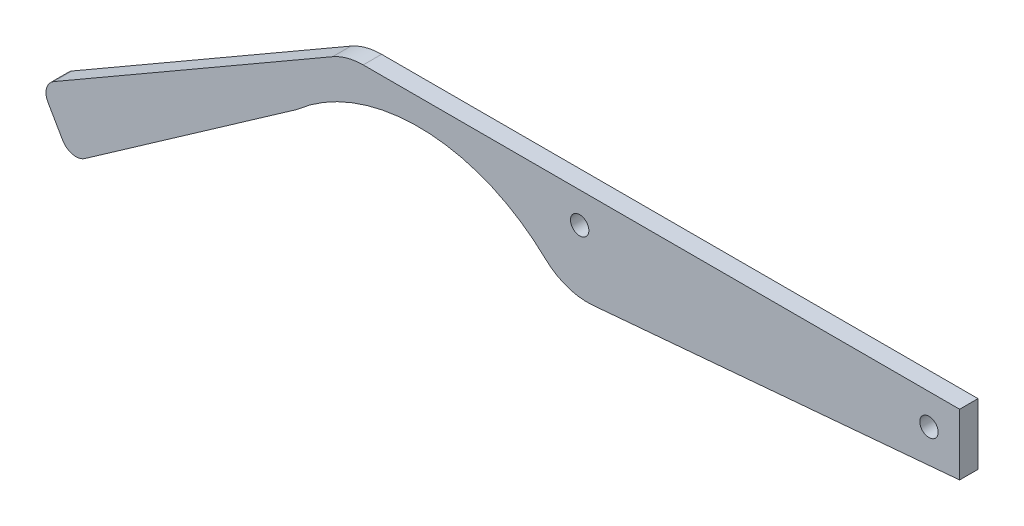
ISO-10303-21;
HEADER;
FILE_DESCRIPTION(('STEP AP214'),'2;1');
FILE_NAME('part.step','',(''),(''),'','','');
FILE_SCHEMA(('AUTOMOTIVE_DESIGN { 1 0 10303 214 1 1 1 1 }'));
ENDSEC;
DATA;
#1=APPLICATION_CONTEXT('core data for automotive mechanical design processes');
#2=APPLICATION_PROTOCOL_DEFINITION('international standard','automotive_design',2000,#1);
#3=PRODUCT_CONTEXT('',#1,'mechanical');
#4=PRODUCT('Part','Part','',(#3));
#5=PRODUCT_RELATED_PRODUCT_CATEGORY('part','',(#4));
#6=PRODUCT_DEFINITION_FORMATION('','',#4);
#7=PRODUCT_DEFINITION_CONTEXT('part definition',#1,'design');
#8=PRODUCT_DEFINITION('design','',#6,#7);
#9=PRODUCT_DEFINITION_SHAPE('','',#8);
#10=(LENGTH_UNIT() NAMED_UNIT(*) SI_UNIT(.MILLI.,.METRE.));
#11=(NAMED_UNIT(*) PLANE_ANGLE_UNIT() SI_UNIT($,.RADIAN.));
#12=(NAMED_UNIT(*) SI_UNIT($,.STERADIAN.) SOLID_ANGLE_UNIT());
#13=UNCERTAINTY_MEASURE_WITH_UNIT(LENGTH_MEASURE(1.E-05),#10,'distance_accuracy_value','');
#14=(GEOMETRIC_REPRESENTATION_CONTEXT(3) GLOBAL_UNCERTAINTY_ASSIGNED_CONTEXT((#13)) GLOBAL_UNIT_ASSIGNED_CONTEXT((#10,
#11,#12)) REPRESENTATION_CONTEXT('',''));
#15=CARTESIAN_POINT('',(0.,0.,0.));
#16=DIRECTION('',(0.,0.,1.));
#17=DIRECTION('',(1.,0.,0.));
#18=AXIS2_PLACEMENT_3D('',#15,#16,#17);
#19=CARTESIAN_POINT('',(0.,-10.,3.));
#20=DIRECTION('',(-1.,0.,0.));
#21=DIRECTION('',(0.,0.,1.));
#22=AXIS2_PLACEMENT_3D('',#19,#20,#21);
#23=PLANE('',#22);
#24=DIRECTION('',(0.,1.,0.));
#25=VECTOR('',#24,1.);
#26=CARTESIAN_POINT('',(0.,-10.,0.));
#27=LINE('',#26,#25);
#28=CARTESIAN_POINT('',(0.,-10.,0.));
#29=VERTEX_POINT('',#28);
#30=CARTESIAN_POINT('',(0.,0.,0.));
#31=VERTEX_POINT('',#30);
#32=EDGE_CURVE('E153',#29,#31,#27,.T.);
#33=ORIENTED_EDGE('',*,*,#32,.T.);
#34=DIRECTION('',(0.,0.,-1.));
#35=VECTOR('',#34,1.);
#36=CARTESIAN_POINT('',(0.,0.,3.));
#37=LINE('',#36,#35);
#38=CARTESIAN_POINT('',(0.,0.,3.));
#39=VERTEX_POINT('',#38);
#40=EDGE_CURVE('E11',#39,#31,#37,.T.);
#41=ORIENTED_EDGE('',*,*,#40,.F.);
#42=DIRECTION('',(0.,1.,0.));
#43=VECTOR('',#42,1.);
#44=CARTESIAN_POINT('',(0.,-10.,3.));
#45=LINE('',#44,#43);
#46=CARTESIAN_POINT('',(0.,-10.,3.));
#47=VERTEX_POINT('',#46);
#48=EDGE_CURVE('E176',#47,#39,#45,.T.);
#49=ORIENTED_EDGE('',*,*,#48,.F.);
#50=DIRECTION('',(0.,0.,-1.));
#51=VECTOR('',#50,1.);
#52=CARTESIAN_POINT('',(0.,-10.,3.));
#53=LINE('',#52,#51);
#54=EDGE_CURVE('E149',#47,#29,#53,.T.);
#55=ORIENTED_EDGE('',*,*,#54,.T.);
#56=EDGE_LOOP('',(#33,#41,#49,#55));
#57=FACE_BOUND('',#56,.T.);
#58=ADVANCED_FACE('F33',(#57),#23,.F.);
#59=CARTESIAN_POINT('',(0.,0.,3.));
#60=DIRECTION('',(0.,-1.,0.));
#61=DIRECTION('',(1.,0.,0.));
#62=AXIS2_PLACEMENT_3D('',#59,#60,#61);
#63=PLANE('',#62);
#64=DIRECTION('',(-1.,0.,0.));
#65=VECTOR('',#64,1.);
#66=CARTESIAN_POINT('',(0.,0.,0.));
#67=LINE('',#66,#65);
#68=CARTESIAN_POINT('',(-97.3205080756888,0.,0.));
#69=VERTEX_POINT('',#68);
#70=EDGE_CURVE('E156',#31,#69,#67,.T.);
#71=ORIENTED_EDGE('',*,*,#70,.T.);
#72=DIRECTION('',(0.,0.,-1.));
#73=VECTOR('',#72,1.);
#74=CARTESIAN_POINT('',(-97.3205080756888,0.,3.));
#75=LINE('',#74,#73);
#76=CARTESIAN_POINT('',(-97.3205080756888,0.,3.));
#77=VERTEX_POINT('',#76);
#78=EDGE_CURVE('E41',#77,#69,#75,.T.);
#79=ORIENTED_EDGE('',*,*,#78,.F.);
#80=DIRECTION('',(-1.,0.,0.));
#81=VECTOR('',#80,1.);
#82=CARTESIAN_POINT('',(0.,0.,3.));
#83=LINE('',#82,#81);
#84=EDGE_CURVE('E104',#39,#77,#83,.T.);
#85=ORIENTED_EDGE('',*,*,#84,.F.);
#86=ORIENTED_EDGE('',*,*,#40,.T.);
#87=EDGE_LOOP('',(#71,#79,#85,#86));
#88=FACE_BOUND('',#87,.T.);
#89=ADVANCED_FACE('F256',(#88),#63,.F.);
#90=CARTESIAN_POINT('',(-97.3205080756888,-10.,3.));
#91=DIRECTION('',(0.,0.,-1.));
#92=DIRECTION('',(-1.,0.,0.));
#93=AXIS2_PLACEMENT_3D('',#90,#91,#92);
#94=CYLINDRICAL_SURFACE('',#93,10.);
#95=CARTESIAN_POINT('',(-97.3205080756888,-10.,0.));
#96=DIRECTION('',(0.,0.,1.));
#97=DIRECTION('',(1.,0.,0.));
#98=AXIS2_PLACEMENT_3D('',#95,#96,#97);
#99=CIRCLE('',#98,10.);
#100=CARTESIAN_POINT('',(-102.320508075689,-1.33974596215564,0.));
#101=VERTEX_POINT('',#100);
#102=EDGE_CURVE('E159',#69,#101,#99,.T.);
#103=ORIENTED_EDGE('',*,*,#102,.T.);
#104=DIRECTION('',(0.,0.,-1.));
#105=VECTOR('',#104,1.);
#106=CARTESIAN_POINT('',(-102.320508075689,-1.33974596215564,3.));
#107=LINE('',#106,#105);
#108=CARTESIAN_POINT('',(-102.320508075689,-1.33974596215564,3.));
#109=VERTEX_POINT('',#108);
#110=EDGE_CURVE('E195',#109,#101,#107,.T.);
#111=ORIENTED_EDGE('',*,*,#110,.F.);
#112=CARTESIAN_POINT('',(-97.3205080756888,-10.,3.));
#113=DIRECTION('',(0.,0.,1.));
#114=DIRECTION('',(1.,0.,0.));
#115=AXIS2_PLACEMENT_3D('',#112,#113,#114);
#116=CIRCLE('',#115,10.);
#117=EDGE_CURVE('E203',#77,#109,#116,.T.);
#118=ORIENTED_EDGE('',*,*,#117,.F.);
#119=ORIENTED_EDGE('',*,*,#78,.T.);
#120=EDGE_LOOP('',(#103,#111,#118,#119));
#121=FACE_BOUND('',#120,.T.);
#122=ADVANCED_FACE('F201',(#121),#94,.T.);
#123=CARTESIAN_POINT('',(-102.320508075689,-1.33974596215564,3.));
#124=DIRECTION('',(0.500000000000001,-0.866025403784438,0.));
#125=DIRECTION('',(0.866025403784438,0.500000000000002,0.));
#126=AXIS2_PLACEMENT_3D('',#123,#124,#125);
#127=PLANE('',#126);
#128=DIRECTION('',(-0.866025403784438,-0.500000000000002,0.));
#129=VECTOR('',#128,1.);
#130=CARTESIAN_POINT('',(-102.320508075689,-1.33974596215564,0.));
#131=LINE('',#130,#129);
#132=CARTESIAN_POINT('',(-147.834936490539,-27.6175134594814,0.));
#133=VERTEX_POINT('',#132);
#134=EDGE_CURVE('E161',#101,#133,#131,.T.);
#135=ORIENTED_EDGE('',*,*,#134,.T.);
#136=DIRECTION('',(0.,0.,-1.));
#137=VECTOR('',#136,1.);
#138=CARTESIAN_POINT('',(-147.834936490539,-27.6175134594814,3.));
#139=LINE('',#138,#137);
#140=CARTESIAN_POINT('',(-147.834936490539,-27.6175134594814,3.));
#141=VERTEX_POINT('',#140);
#142=EDGE_CURVE('E192',#141,#133,#139,.T.);
#143=ORIENTED_EDGE('',*,*,#142,.F.);
#144=DIRECTION('',(-0.866025403784438,-0.500000000000002,0.));
#145=VECTOR('',#144,1.);
#146=CARTESIAN_POINT('',(-102.320508075689,-1.33974596215564,3.));
#147=LINE('',#146,#145);
#148=EDGE_CURVE('E221',#109,#141,#147,.T.);
#149=ORIENTED_EDGE('',*,*,#148,.F.);
#150=ORIENTED_EDGE('',*,*,#110,.T.);
#151=EDGE_LOOP('',(#135,#143,#149,#150));
#152=FACE_BOUND('',#151,.T.);
#153=ADVANCED_FACE('F212',(#152),#127,.F.);
#154=CARTESIAN_POINT('',(-146.584936490539,-29.7825769689425,3.));
#155=DIRECTION('',(0.,0.,-1.));
#156=DIRECTION('',(-1.,0.,0.));
#157=AXIS2_PLACEMENT_3D('',#154,#155,#156);
#158=CYLINDRICAL_SURFACE('',#157,2.50000000000001);
#159=CARTESIAN_POINT('',(-146.584936490539,-29.7825769689425,0.));
#160=DIRECTION('',(0.,0.,1.));
#161=DIRECTION('',(1.,0.,0.));
#162=AXIS2_PLACEMENT_3D('',#159,#160,#161);
#163=CIRCLE('',#162,2.50000000000001);
#164=CARTESIAN_POINT('',(-148.75,-31.0325769689425,0.));
#165=VERTEX_POINT('',#164);
#166=EDGE_CURVE('E163',#133,#165,#163,.T.);
#167=ORIENTED_EDGE('',*,*,#166,.T.);
#168=DIRECTION('',(0.,0.,-1.));
#169=VECTOR('',#168,1.);
#170=CARTESIAN_POINT('',(-148.75,-31.0325769689425,3.));
#171=LINE('',#170,#169);
#172=CARTESIAN_POINT('',(-148.75,-31.0325769689425,3.));
#173=VERTEX_POINT('',#172);
#174=EDGE_CURVE('E189',#173,#165,#171,.T.);
#175=ORIENTED_EDGE('',*,*,#174,.F.);
#176=CARTESIAN_POINT('',(-146.584936490539,-29.7825769689425,3.));
#177=DIRECTION('',(0.,0.,1.));
#178=DIRECTION('',(1.,0.,0.));
#179=AXIS2_PLACEMENT_3D('',#176,#177,#178);
#180=CIRCLE('',#179,2.50000000000001);
#181=EDGE_CURVE('E218',#141,#173,#180,.T.);
#182=ORIENTED_EDGE('',*,*,#181,.F.);
#183=ORIENTED_EDGE('',*,*,#142,.T.);
#184=EDGE_LOOP('',(#167,#175,#182,#183));
#185=FACE_BOUND('',#184,.T.);
#186=ADVANCED_FACE('F216',(#185),#158,.T.);
#187=CARTESIAN_POINT('',(-148.75,-31.0325769689425,3.));
#188=DIRECTION('',(0.866025403784435,0.500000000000006,0.));
#189=DIRECTION('',(-0.500000000000006,0.866025403784435,0.));
#190=AXIS2_PLACEMENT_3D('',#187,#188,#189);
#191=PLANE('',#190);
#192=DIRECTION('',(0.500000000000006,-0.866025403784435,0.));
#193=VECTOR('',#192,1.);
#194=CARTESIAN_POINT('',(-148.75,-31.0325769689425,0.));
#195=LINE('',#194,#193);
#196=CARTESIAN_POINT('',(-146.364135626337,-35.165015284096,0.));
#197=VERTEX_POINT('',#196);
#198=EDGE_CURVE('E165',#165,#197,#195,.T.);
#199=ORIENTED_EDGE('',*,*,#198,.T.);
#200=DIRECTION('',(0.,0.,-1.));
#201=VECTOR('',#200,1.);
#202=CARTESIAN_POINT('',(-146.364135626337,-35.165015284096,3.));
#203=LINE('',#202,#201);
#204=CARTESIAN_POINT('',(-146.364135626337,-35.165015284096,3.));
#205=VERTEX_POINT('',#204);
#206=EDGE_CURVE('E186',#205,#197,#203,.T.);
#207=ORIENTED_EDGE('',*,*,#206,.F.);
#208=DIRECTION('',(0.500000000000006,-0.866025403784435,0.));
#209=VECTOR('',#208,1.);
#210=CARTESIAN_POINT('',(-148.75,-31.0325769689425,3.));
#211=LINE('',#210,#209);
#212=EDGE_CURVE('E220',#173,#205,#211,.T.);
#213=ORIENTED_EDGE('',*,*,#212,.F.);
#214=ORIENTED_EDGE('',*,*,#174,.T.);
#215=EDGE_LOOP('',(#199,#207,#213,#214));
#216=FACE_BOUND('',#215,.T.);
#217=ADVANCED_FACE('F269',(#216),#191,.F.);
#218=CARTESIAN_POINT('',(-144.199072116875,-33.915015284096,3.));
#219=DIRECTION('',(0.,0.,-1.));
#220=DIRECTION('',(-1.,0.,0.));
#221=AXIS2_PLACEMENT_3D('',#218,#219,#220);
#222=CYLINDRICAL_SURFACE('',#221,2.49999999999999);
#223=CARTESIAN_POINT('',(-144.199072116875,-33.915015284096,0.));
#224=DIRECTION('',(0.,0.,1.));
#225=DIRECTION('',(1.,0.,0.));
#226=AXIS2_PLACEMENT_3D('',#223,#224,#225);
#227=CIRCLE('',#226,2.49999999999999);
#228=CARTESIAN_POINT('',(-142.765131025998,-35.9628953948185,0.));
#229=VERTEX_POINT('',#228);
#230=EDGE_CURVE('E167',#197,#229,#227,.T.);
#231=ORIENTED_EDGE('',*,*,#230,.T.);
#232=DIRECTION('',(0.,0.,-1.));
#233=VECTOR('',#232,1.);
#234=CARTESIAN_POINT('',(-142.765131025998,-35.9628953948185,3.));
#235=LINE('',#234,#233);
#236=CARTESIAN_POINT('',(-142.765131025998,-35.9628953948185,3.));
#237=VERTEX_POINT('',#236);
#238=EDGE_CURVE('E183',#237,#229,#235,.T.);
#239=ORIENTED_EDGE('',*,*,#238,.F.);
#240=CARTESIAN_POINT('',(-144.199072116875,-33.915015284096,3.));
#241=DIRECTION('',(0.,0.,1.));
#242=DIRECTION('',(1.,0.,0.));
#243=AXIS2_PLACEMENT_3D('',#240,#241,#242);
#244=CIRCLE('',#243,2.49999999999999);
#245=EDGE_CURVE('E223',#205,#237,#244,.T.);
#246=ORIENTED_EDGE('',*,*,#245,.F.);
#247=ORIENTED_EDGE('',*,*,#206,.T.);
#248=EDGE_LOOP('',(#231,#239,#246,#247));
#249=FACE_BOUND('',#248,.T.);
#250=ADVANCED_FACE('F272',(#249),#222,.T.);
#251=CARTESIAN_POINT('',(-142.765131025998,-35.9628953948185,3.));
#252=DIRECTION('',(-0.573576436351051,0.819152044288988,0.));
#253=DIRECTION('',(-0.819152044288989,-0.573576436351051,0.));
#254=AXIS2_PLACEMENT_3D('',#251,#252,#253);
#255=PLANE('',#254);
#256=DIRECTION('',(0.819152044288989,0.573576436351051,0.));
#257=VECTOR('',#256,1.);
#258=CARTESIAN_POINT('',(-142.765131025998,-35.9628953948185,0.));
#259=LINE('',#258,#257);
#260=CARTESIAN_POINT('',(-108.249632242699,-11.7948829616843,0.));
#261=VERTEX_POINT('',#260);
#262=EDGE_CURVE('E169',#229,#261,#259,.T.);
#263=ORIENTED_EDGE('',*,*,#262,.T.);
#264=DIRECTION('',(0.,0.,-1.));
#265=VECTOR('',#264,1.);
#266=CARTESIAN_POINT('',(-108.249632242699,-11.7948829616843,3.));
#267=LINE('',#266,#265);
#268=CARTESIAN_POINT('',(-108.249632242699,-11.7948829616843,3.));
#269=VERTEX_POINT('',#268);
#270=EDGE_CURVE('E180',#269,#261,#267,.T.);
#271=ORIENTED_EDGE('',*,*,#270,.F.);
#272=DIRECTION('',(0.819152044288989,0.573576436351051,0.));
#273=VECTOR('',#272,1.);
#274=CARTESIAN_POINT('',(-142.765131025998,-35.9628953948185,3.));
#275=LINE('',#274,#273);
#276=EDGE_CURVE('E229',#237,#269,#275,.T.);
#277=ORIENTED_EDGE('',*,*,#276,.F.);
#278=ORIENTED_EDGE('',*,*,#238,.T.);
#279=EDGE_LOOP('',(#263,#271,#277,#278));
#280=FACE_BOUND('',#279,.T.);
#281=ADVANCED_FACE('F235',(#280),#255,.F.);
#282=CARTESIAN_POINT('',(-109.683573333577,-9.74700285096188,3.));
#283=DIRECTION('',(0.,0.,-1.));
#284=DIRECTION('',(-1.,0.,0.));
#285=AXIS2_PLACEMENT_3D('',#282,#283,#284);
#286=CYLINDRICAL_SURFACE('',#285,2.49999999999999);
#287=CARTESIAN_POINT('',(-109.683573333577,-9.74700285096188,0.));
#288=DIRECTION('',(0.,0.,1.));
#289=DIRECTION('',(1.,0.,0.));
#290=AXIS2_PLACEMENT_3D('',#287,#288,#289);
#291=CIRCLE('',#290,2.49999999999999);
#292=CARTESIAN_POINT('',(-108.039833803987,-11.6306483480934,0.));
#293=VERTEX_POINT('',#292);
#294=EDGE_CURVE('E171',#261,#293,#291,.T.);
#295=ORIENTED_EDGE('',*,*,#294,.T.);
#296=DIRECTION('',(0.,0.,-1.));
#297=VECTOR('',#296,1.);
#298=CARTESIAN_POINT('',(-108.039833803987,-11.6306483480934,3.));
#299=LINE('',#298,#297);
#300=CARTESIAN_POINT('',(-108.039833803987,-11.6306483480934,3.));
#301=VERTEX_POINT('',#300);
#302=EDGE_CURVE('E144',#301,#293,#299,.T.);
#303=ORIENTED_EDGE('',*,*,#302,.F.);
#304=CARTESIAN_POINT('',(-109.683573333577,-9.74700285096188,3.));
#305=DIRECTION('',(0.,0.,1.));
#306=DIRECTION('',(1.,0.,0.));
#307=AXIS2_PLACEMENT_3D('',#304,#305,#306);
#308=CIRCLE('',#307,2.49999999999999);
#309=EDGE_CURVE('E135',#269,#301,#308,.T.);
#310=ORIENTED_EDGE('',*,*,#309,.F.);
#311=ORIENTED_EDGE('',*,*,#270,.T.);
#312=EDGE_LOOP('',(#295,#303,#310,#311));
#313=FACE_BOUND('',#312,.T.);
#314=ADVANCED_FACE('F239',(#313),#286,.T.);
#315=CARTESIAN_POINT('',(-88.3149594489092,-34.2343943136717,3.));
#316=DIRECTION('',(0.,0.,-1.));
#317=DIRECTION('',(-1.,0.,0.));
#318=AXIS2_PLACEMENT_3D('',#315,#316,#317);
#319=CYLINDRICAL_SURFACE('',#318,30.);
#320=CARTESIAN_POINT('',(-88.3149594489092,-34.2343943136717,0.));
#321=DIRECTION('',(0.,0.,-1.));
#322=DIRECTION('',(-1.,0.,0.));
#323=AXIS2_PLACEMENT_3D('',#320,#321,#322);
#324=CIRCLE('',#323,30.);
#325=CARTESIAN_POINT('',(-67.620976194796,-12.5143791875609,0.));
#326=VERTEX_POINT('',#325);
#327=EDGE_CURVE('E143',#293,#326,#324,.T.);
#328=ORIENTED_EDGE('',*,*,#327,.T.);
#329=DIRECTION('',(0.,0.,-1.));
#330=VECTOR('',#329,1.);
#331=CARTESIAN_POINT('',(-67.620976194796,-12.5143791875609,3.));
#332=LINE('',#331,#330);
#333=CARTESIAN_POINT('',(-67.620976194796,-12.5143791875609,3.));
#334=VERTEX_POINT('',#333);
#335=EDGE_CURVE('E140',#334,#326,#332,.T.);
#336=ORIENTED_EDGE('',*,*,#335,.F.);
#337=CARTESIAN_POINT('',(-88.3149594489092,-34.2343943136717,3.));
#338=DIRECTION('',(0.,0.,-1.));
#339=DIRECTION('',(-1.,0.,0.));
#340=AXIS2_PLACEMENT_3D('',#337,#338,#339);
#341=CIRCLE('',#340,30.);
#342=EDGE_CURVE('E129',#301,#334,#341,.T.);
#343=ORIENTED_EDGE('',*,*,#342,.F.);
#344=ORIENTED_EDGE('',*,*,#302,.T.);
#345=EDGE_LOOP('',(#328,#336,#343,#344));
#346=FACE_BOUND('',#345,.T.);
#347=ADVANCED_FACE('F141',(#346),#319,.F.);
#348=CARTESIAN_POINT('',(-60.7229817767583,-5.27437414552395,3.));
#349=DIRECTION('',(0.,0.,-1.));
#350=DIRECTION('',(-1.,0.,0.));
#351=AXIS2_PLACEMENT_3D('',#348,#349,#350);
#352=CYLINDRICAL_SURFACE('',#351,9.99999999999999);
#353=CARTESIAN_POINT('',(-60.7229817767583,-5.27437414552395,0.));
#354=DIRECTION('',(0.,0.,1.));
#355=DIRECTION('',(1.,0.,0.));
#356=AXIS2_PLACEMENT_3D('',#353,#354,#355);
#357=CIRCLE('',#356,9.99999999999999);
#358=CARTESIAN_POINT('',(-59.8514243492818,-15.2363211264414,0.));
#359=VERTEX_POINT('',#358);
#360=EDGE_CURVE('E90',#326,#359,#357,.T.);
#361=ORIENTED_EDGE('',*,*,#360,.T.);
#362=DIRECTION('',(0.,0.,-1.));
#363=VECTOR('',#362,1.);
#364=CARTESIAN_POINT('',(-59.8514243492818,-15.2363211264414,3.));
#365=LINE('',#364,#363);
#366=CARTESIAN_POINT('',(-59.8514243492818,-15.2363211264414,3.));
#367=VERTEX_POINT('',#366);
#368=EDGE_CURVE('E145',#367,#359,#365,.T.);
#369=ORIENTED_EDGE('',*,*,#368,.F.);
#370=CARTESIAN_POINT('',(-60.7229817767583,-5.27437414552395,3.));
#371=DIRECTION('',(0.,0.,1.));
#372=DIRECTION('',(1.,0.,0.));
#373=AXIS2_PLACEMENT_3D('',#370,#371,#372);
#374=CIRCLE('',#373,9.99999999999999);
#375=EDGE_CURVE('E133',#334,#367,#374,.T.);
#376=ORIENTED_EDGE('',*,*,#375,.F.);
#377=ORIENTED_EDGE('',*,*,#335,.T.);
#378=EDGE_LOOP('',(#361,#369,#376,#377));
#379=FACE_BOUND('',#378,.T.);
#380=ADVANCED_FACE('F147',(#379),#352,.T.);
#381=CARTESIAN_POINT('',(-59.8514243492818,-15.2363211264414,3.));
#382=DIRECTION('',(-0.0871557427476548,0.996194698091746,0.));
#383=DIRECTION('',(-0.996194698091746,-0.0871557427476548,0.));
#384=AXIS2_PLACEMENT_3D('',#381,#382,#383);
#385=PLANE('',#384);
#386=DIRECTION('',(0.996194698091746,0.0871557427476548,0.));
#387=VECTOR('',#386,1.);
#388=CARTESIAN_POINT('',(-59.8514243492818,-15.2363211264414,0.));
#389=LINE('',#388,#387);
#390=EDGE_CURVE('E96',#359,#29,#389,.T.);
#391=ORIENTED_EDGE('',*,*,#390,.T.);
#392=ORIENTED_EDGE('',*,*,#54,.F.);
#393=DIRECTION('',(0.996194698091746,0.0871557427476548,0.));
#394=VECTOR('',#393,1.);
#395=CARTESIAN_POINT('',(-59.8514243492818,-15.2363211264414,3.));
#396=LINE('',#395,#394);
#397=EDGE_CURVE('E49',#367,#47,#396,.T.);
#398=ORIENTED_EDGE('',*,*,#397,.F.);
#399=ORIENTED_EDGE('',*,*,#368,.T.);
#400=EDGE_LOOP('',(#391,#392,#398,#399));
#401=FACE_BOUND('',#400,.T.);
#402=ADVANCED_FACE('F243',(#401),#385,.F.);
#403=CARTESIAN_POINT('',(-97.3205080756888,-10.,3.));
#404=DIRECTION('',(0.,0.,1.));
#405=DIRECTION('',(1.,0.,0.));
#406=AXIS2_PLACEMENT_3D('',#403,#404,#405);
#407=PLANE('',#406);
#408=CARTESIAN_POINT('',(-5.,-5.,3.));
#409=DIRECTION('',(0.,0.,1.));
#410=DIRECTION('',(1.,0.,0.));
#411=AXIS2_PLACEMENT_3D('',#408,#409,#410);
#412=CIRCLE('',#411,1.5);
#413=CARTESIAN_POINT('',(-3.5,-5.,3.));
#414=VERTEX_POINT('',#413);
#415=EDGE_CURVE('E157',#414,#414,#412,.T.);
#416=ORIENTED_EDGE('',*,*,#415,.F.);
#417=EDGE_LOOP('',(#416));
#418=FACE_BOUND('',#417,.T.);
#419=CARTESIAN_POINT('',(-62.,-4.99999999999999,3.));
#420=DIRECTION('',(0.,0.,1.));
#421=DIRECTION('',(1.,0.,0.));
#422=AXIS2_PLACEMENT_3D('',#419,#420,#421);
#423=CIRCLE('',#422,1.5);
#424=CARTESIAN_POINT('',(-60.5,-4.99999999999999,3.));
#425=VERTEX_POINT('',#424);
#426=EDGE_CURVE('E333',#425,#425,#423,.T.);
#427=ORIENTED_EDGE('',*,*,#426,.F.);
#428=EDGE_LOOP('',(#427));
#429=FACE_BOUND('',#428,.T.);
#430=ORIENTED_EDGE('',*,*,#48,.T.);
#431=ORIENTED_EDGE('',*,*,#84,.T.);
#432=ORIENTED_EDGE('',*,*,#117,.T.);
#433=ORIENTED_EDGE('',*,*,#148,.T.);
#434=ORIENTED_EDGE('',*,*,#181,.T.);
#435=ORIENTED_EDGE('',*,*,#212,.T.);
#436=ORIENTED_EDGE('',*,*,#245,.T.);
#437=ORIENTED_EDGE('',*,*,#276,.T.);
#438=ORIENTED_EDGE('',*,*,#309,.T.);
#439=ORIENTED_EDGE('',*,*,#342,.T.);
#440=ORIENTED_EDGE('',*,*,#375,.T.);
#441=ORIENTED_EDGE('',*,*,#397,.T.);
#442=EDGE_LOOP('',(#430,#431,#432,#433,#434,#435,#436,#437,#438,#439,#440,#441));
#443=FACE_BOUND('',#442,.T.);
#444=ADVANCED_FACE('F131',(#418,#429,#443),#407,.T.);
#445=CARTESIAN_POINT('',(-97.3205080756888,-10.,0.));
#446=DIRECTION('',(0.,0.,1.));
#447=DIRECTION('',(1.,0.,0.));
#448=AXIS2_PLACEMENT_3D('',#445,#446,#447);
#449=PLANE('',#448);
#450=CARTESIAN_POINT('',(-5.,-5.,0.));
#451=DIRECTION('',(0.,0.,-1.));
#452=DIRECTION('',(-1.,0.,0.));
#453=AXIS2_PLACEMENT_3D('',#450,#451,#452);
#454=CIRCLE('',#453,1.5);
#455=CARTESIAN_POINT('',(-6.5,-5.,0.));
#456=VERTEX_POINT('',#455);
#457=EDGE_CURVE('E332',#456,#456,#454,.T.);
#458=ORIENTED_EDGE('',*,*,#457,.F.);
#459=EDGE_LOOP('',(#458));
#460=FACE_BOUND('',#459,.T.);
#461=CARTESIAN_POINT('',(-62.,-4.99999999999999,0.));
#462=DIRECTION('',(0.,0.,-1.));
#463=DIRECTION('',(-1.,0.,0.));
#464=AXIS2_PLACEMENT_3D('',#461,#462,#463);
#465=CIRCLE('',#464,1.5);
#466=CARTESIAN_POINT('',(-63.5,-4.99999999999999,0.));
#467=VERTEX_POINT('',#466);
#468=EDGE_CURVE('E334',#467,#467,#465,.T.);
#469=ORIENTED_EDGE('',*,*,#468,.F.);
#470=EDGE_LOOP('',(#469));
#471=FACE_BOUND('',#470,.T.);
#472=ORIENTED_EDGE('',*,*,#32,.F.);
#473=ORIENTED_EDGE('',*,*,#390,.F.);
#474=ORIENTED_EDGE('',*,*,#360,.F.);
#475=ORIENTED_EDGE('',*,*,#327,.F.);
#476=ORIENTED_EDGE('',*,*,#294,.F.);
#477=ORIENTED_EDGE('',*,*,#262,.F.);
#478=ORIENTED_EDGE('',*,*,#230,.F.);
#479=ORIENTED_EDGE('',*,*,#198,.F.);
#480=ORIENTED_EDGE('',*,*,#166,.F.);
#481=ORIENTED_EDGE('',*,*,#134,.F.);
#482=ORIENTED_EDGE('',*,*,#102,.F.);
#483=ORIENTED_EDGE('',*,*,#70,.F.);
#484=EDGE_LOOP('',(#472,#473,#474,#475,#476,#477,#478,#479,#480,#481,#482,#483));
#485=FACE_BOUND('',#484,.T.);
#486=ADVANCED_FACE('F207',(#460,#471,#485),#449,.F.);
#487=CARTESIAN_POINT('',(-62.,-4.99999999999999,10.));
#488=DIRECTION('',(0.,0.,-1.));
#489=DIRECTION('',(-1.,0.,0.));
#490=AXIS2_PLACEMENT_3D('',#487,#488,#489);
#491=CYLINDRICAL_SURFACE('',#490,1.5);
#492=ORIENTED_EDGE('',*,*,#426,.T.);
#493=EDGE_LOOP('',(#492));
#494=FACE_BOUND('',#493,.T.);
#495=ORIENTED_EDGE('',*,*,#468,.T.);
#496=EDGE_LOOP('',(#495));
#497=FACE_BOUND('',#496,.T.);
#498=ADVANCED_FACE('F305',(#494,#497),#491,.F.);
#499=CARTESIAN_POINT('',(-5.,-5.,10.));
#500=DIRECTION('',(0.,0.,-1.));
#501=DIRECTION('',(-1.,0.,0.));
#502=AXIS2_PLACEMENT_3D('',#499,#500,#501);
#503=CYLINDRICAL_SURFACE('',#502,1.5);
#504=ORIENTED_EDGE('',*,*,#415,.T.);
#505=EDGE_LOOP('',(#504));
#506=FACE_BOUND('',#505,.T.);
#507=ORIENTED_EDGE('',*,*,#457,.T.);
#508=EDGE_LOOP('',(#507));
#509=FACE_BOUND('',#508,.T.);
#510=ADVANCED_FACE('F313',(#506,#509),#503,.F.);
#511=CLOSED_SHELL('',(#58,#89,#122,#153,#186,#217,#250,#281,#314,#347,#380,#402,#444,#486,#498,#510));
#512=MANIFOLD_SOLID_BREP('B2',#511);
#513=ADVANCED_BREP_SHAPE_REPRESENTATION('',(#18,#512),#14);
#514=SHAPE_DEFINITION_REPRESENTATION(#9,#513);
ENDSEC;
END-ISO-10303-21;
